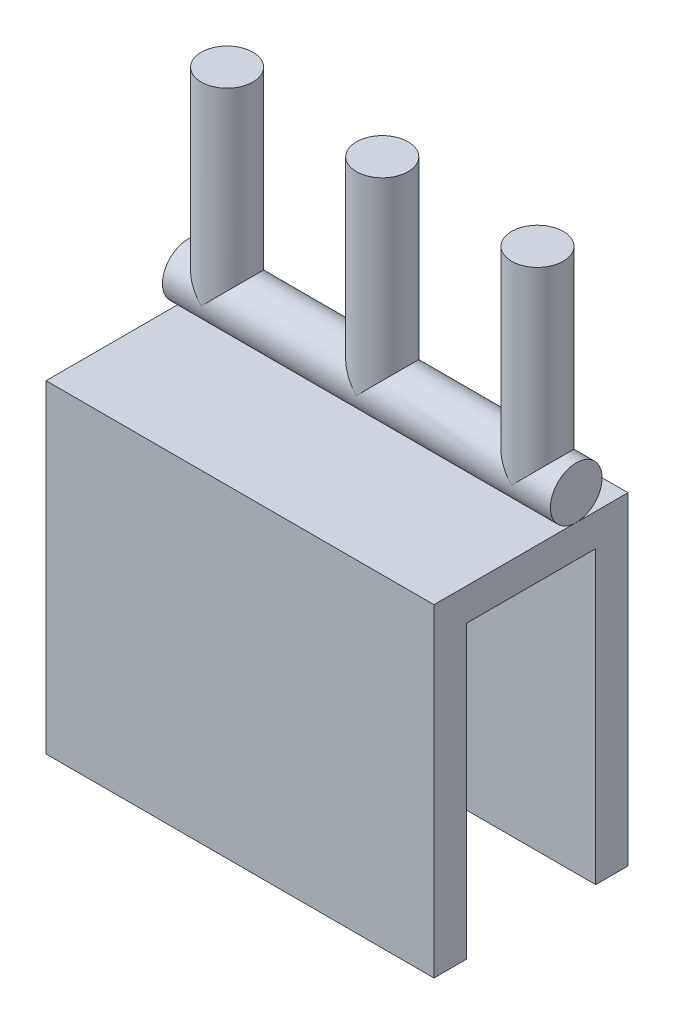
ISO-10303-21;
HEADER;
FILE_DESCRIPTION(('STEP AP214'),'2;1');
FILE_NAME('part.step','',(''),(''),'','','');
FILE_SCHEMA(('AUTOMOTIVE_DESIGN { 1 0 10303 214 1 1 1 1 }'));
ENDSEC;
DATA;
#1=APPLICATION_CONTEXT('core data for automotive mechanical design processes');
#2=APPLICATION_PROTOCOL_DEFINITION('international standard','automotive_design',2000,#1);
#3=PRODUCT_CONTEXT('',#1,'mechanical');
#4=PRODUCT('Part','Part','',(#3));
#5=PRODUCT_RELATED_PRODUCT_CATEGORY('part','',(#4));
#6=PRODUCT_DEFINITION_FORMATION('','',#4);
#7=PRODUCT_DEFINITION_CONTEXT('part definition',#1,'design');
#8=PRODUCT_DEFINITION('design','',#6,#7);
#9=PRODUCT_DEFINITION_SHAPE('','',#8);
#10=(LENGTH_UNIT() NAMED_UNIT(*) SI_UNIT(.MILLI.,.METRE.));
#11=(NAMED_UNIT(*) PLANE_ANGLE_UNIT() SI_UNIT($,.RADIAN.));
#12=(NAMED_UNIT(*) SI_UNIT($,.STERADIAN.) SOLID_ANGLE_UNIT());
#13=UNCERTAINTY_MEASURE_WITH_UNIT(LENGTH_MEASURE(1.E-05),#10,'distance_accuracy_value','');
#14=(GEOMETRIC_REPRESENTATION_CONTEXT(3) GLOBAL_UNCERTAINTY_ASSIGNED_CONTEXT((#13)) GLOBAL_UNIT_ASSIGNED_CONTEXT((#10,
#11,#12)) REPRESENTATION_CONTEXT('',''));
#15=CARTESIAN_POINT('',(0.,0.,0.));
#16=DIRECTION('',(0.,0.,1.));
#17=DIRECTION('',(1.,0.,0.));
#18=AXIS2_PLACEMENT_3D('',#15,#16,#17);
#19=CARTESIAN_POINT('',(300.,145.,-35.));
#20=DIRECTION('',(-1.,0.,0.));
#21=DIRECTION('',(0.,0.,1.));
#22=AXIS2_PLACEMENT_3D('',#19,#20,#21);
#23=CYLINDRICAL_SURFACE('',#22,20.);
#24=CARTESIAN_POINT('',(150.,145.,-35.));
#25=DIRECTION('',(-0.707106781186547,-0.707106781186547,0.));
#26=DIRECTION('',(-0.707106781186547,0.707106781186547,0.));
#27=AXIS2_PLACEMENT_3D('',#24,#25,#26);
#28=ELLIPSE('',#27,28.2842712474619,20.);
#29=CARTESIAN_POINT('',(150.,145.,-55.));
#30=VERTEX_POINT('',#29);
#31=CARTESIAN_POINT('',(150.,145.,-15.));
#32=VERTEX_POINT('',#31);
#33=EDGE_CURVE('E74',#30,#32,#28,.F.);
#34=ORIENTED_EDGE('',*,*,#33,.F.);
#35=CARTESIAN_POINT('',(150.,145.,-35.));
#36=DIRECTION('',(-0.707106781186547,0.707106781186547,0.));
#37=DIRECTION('',(-0.707106781186547,-0.707106781186547,0.));
#38=AXIS2_PLACEMENT_3D('',#35,#36,#37);
#39=ELLIPSE('',#38,28.2842712474619,20.);
#40=EDGE_CURVE('E61',#32,#30,#39,.T.);
#41=ORIENTED_EDGE('',*,*,#40,.F.);
#42=EDGE_LOOP('',(#34,#41));
#43=FACE_BOUND('',#42,.T.);
#44=CARTESIAN_POINT('',(0.,145.,-35.));
#45=DIRECTION('',(1.,0.,0.));
#46=DIRECTION('',(0.,0.,-1.));
#47=AXIS2_PLACEMENT_3D('',#44,#45,#46);
#48=CIRCLE('',#47,20.);
#49=CARTESIAN_POINT('',(0.,145.,-55.));
#50=VERTEX_POINT('',#49);
#51=EDGE_CURVE('E85',#50,#50,#48,.T.);
#52=ORIENTED_EDGE('',*,*,#51,.T.);
#53=EDGE_LOOP('',(#52));
#54=FACE_BOUND('',#53,.T.);
#55=CARTESIAN_POINT('',(300.,145.,-35.));
#56=DIRECTION('',(1.,0.,0.));
#57=DIRECTION('',(0.,0.,-1.));
#58=AXIS2_PLACEMENT_3D('',#55,#56,#57);
#59=CIRCLE('',#58,20.);
#60=CARTESIAN_POINT('',(300.,145.,-55.));
#61=VERTEX_POINT('',#60);
#62=EDGE_CURVE('E84',#61,#61,#59,.T.);
#63=ORIENTED_EDGE('',*,*,#62,.F.);
#64=EDGE_LOOP('',(#63));
#65=FACE_BOUND('',#64,.T.);
#66=CARTESIAN_POINT('',(30.,145.,-35.));
#67=DIRECTION('',(-0.707106781186547,-0.707106781186547,0.));
#68=DIRECTION('',(-0.707106781186547,0.707106781186547,0.));
#69=AXIS2_PLACEMENT_3D('',#66,#67,#68);
#70=ELLIPSE('',#69,28.2842712474619,20.);
#71=CARTESIAN_POINT('',(30.,145.,-55.));
#72=VERTEX_POINT('',#71);
#73=CARTESIAN_POINT('',(30.,145.,-15.));
#74=VERTEX_POINT('',#73);
#75=EDGE_CURVE('E78',#72,#74,#70,.F.);
#76=ORIENTED_EDGE('',*,*,#75,.F.);
#77=CARTESIAN_POINT('',(30.,145.,-35.));
#78=DIRECTION('',(-0.707106781186547,0.707106781186547,0.));
#79=DIRECTION('',(-0.707106781186547,-0.707106781186547,0.));
#80=AXIS2_PLACEMENT_3D('',#77,#78,#79);
#81=ELLIPSE('',#80,28.2842712474619,20.);
#82=EDGE_CURVE('E81',#74,#72,#81,.T.);
#83=ORIENTED_EDGE('',*,*,#82,.F.);
#84=EDGE_LOOP('',(#76,#83));
#85=FACE_BOUND('',#84,.T.);
#86=CARTESIAN_POINT('',(270.,145.,-35.));
#87=DIRECTION('',(-0.707106781186547,-0.707106781186547,0.));
#88=DIRECTION('',(-0.707106781186547,0.707106781186547,0.));
#89=AXIS2_PLACEMENT_3D('',#86,#87,#88);
#90=ELLIPSE('',#89,28.2842712474619,20.);
#91=CARTESIAN_POINT('',(270.,145.,-55.));
#92=VERTEX_POINT('',#91);
#93=CARTESIAN_POINT('',(270.,145.,-15.));
#94=VERTEX_POINT('',#93);
#95=EDGE_CURVE('E12',#92,#94,#90,.F.);
#96=ORIENTED_EDGE('',*,*,#95,.F.);
#97=CARTESIAN_POINT('',(270.,145.,-35.));
#98=DIRECTION('',(-0.707106781186547,0.707106781186547,0.));
#99=DIRECTION('',(-0.707106781186547,-0.707106781186547,0.));
#100=AXIS2_PLACEMENT_3D('',#97,#98,#99);
#101=ELLIPSE('',#100,28.2842712474619,20.);
#102=EDGE_CURVE('E50',#94,#92,#101,.T.);
#103=ORIENTED_EDGE('',*,*,#102,.F.);
#104=EDGE_LOOP('',(#96,#103));
#105=FACE_BOUND('',#104,.T.);
#106=ADVANCED_FACE('F43',(#43,#54,#65,#85,#105),#23,.T.);
#107=CARTESIAN_POINT('',(300.,145.,-35.));
#108=DIRECTION('',(1.,0.,0.));
#109=DIRECTION('',(0.,0.,-1.));
#110=AXIS2_PLACEMENT_3D('',#107,#108,#109);
#111=PLANE('',#110);
#112=ORIENTED_EDGE('',*,*,#62,.T.);
#113=EDGE_LOOP('',(#112));
#114=FACE_BOUND('',#113,.T.);
#115=ADVANCED_FACE('F114',(#114),#111,.T.);
#116=CARTESIAN_POINT('',(0.,145.,-35.));
#117=DIRECTION('',(1.,0.,0.));
#118=DIRECTION('',(0.,0.,-1.));
#119=AXIS2_PLACEMENT_3D('',#116,#117,#118);
#120=PLANE('',#119);
#121=ORIENTED_EDGE('',*,*,#51,.F.);
#122=EDGE_LOOP('',(#121));
#123=FACE_BOUND('',#122,.T.);
#124=ADVANCED_FACE('F118',(#123),#120,.F.);
#125=CARTESIAN_POINT('',(30.,295.,-35.));
#126=DIRECTION('',(0.,-1.,0.));
#127=DIRECTION('',(0.,0.,-1.));
#128=AXIS2_PLACEMENT_3D('',#125,#126,#127);
#129=CYLINDRICAL_SURFACE('',#128,20.);
#130=CARTESIAN_POINT('',(30.,295.,-35.));
#131=DIRECTION('',(0.,1.,0.));
#132=DIRECTION('',(0.,0.,1.));
#133=AXIS2_PLACEMENT_3D('',#130,#131,#132);
#134=CIRCLE('',#133,20.);
#135=CARTESIAN_POINT('',(30.,295.,-15.));
#136=VERTEX_POINT('',#135);
#137=EDGE_CURVE('E88',#136,#136,#134,.T.);
#138=ORIENTED_EDGE('',*,*,#137,.F.);
#139=EDGE_LOOP('',(#138));
#140=FACE_BOUND('',#139,.T.);
#141=ORIENTED_EDGE('',*,*,#82,.T.);
#142=ORIENTED_EDGE('',*,*,#75,.T.);
#143=EDGE_LOOP('',(#141,#142));
#144=FACE_BOUND('',#143,.T.);
#145=ADVANCED_FACE('F127',(#140,#144),#129,.T.);
#146=CARTESIAN_POINT('',(30.,295.,-35.));
#147=DIRECTION('',(0.,1.,0.));
#148=DIRECTION('',(0.,0.,1.));
#149=AXIS2_PLACEMENT_3D('',#146,#147,#148);
#150=PLANE('',#149);
#151=ORIENTED_EDGE('',*,*,#137,.T.);
#152=EDGE_LOOP('',(#151));
#153=FACE_BOUND('',#152,.T.);
#154=ADVANCED_FACE('F129',(#153),#150,.T.);
#155=CARTESIAN_POINT('',(150.,295.,-35.));
#156=DIRECTION('',(0.,-1.,0.));
#157=DIRECTION('',(0.,0.,-1.));
#158=AXIS2_PLACEMENT_3D('',#155,#156,#157);
#159=CYLINDRICAL_SURFACE('',#158,20.);
#160=CARTESIAN_POINT('',(150.,295.,-35.));
#161=DIRECTION('',(0.,1.,0.));
#162=DIRECTION('',(0.,0.,1.));
#163=AXIS2_PLACEMENT_3D('',#160,#161,#162);
#164=CIRCLE('',#163,20.);
#165=CARTESIAN_POINT('',(150.,295.,-15.));
#166=VERTEX_POINT('',#165);
#167=EDGE_CURVE('E93',#166,#166,#164,.T.);
#168=ORIENTED_EDGE('',*,*,#167,.F.);
#169=EDGE_LOOP('',(#168));
#170=FACE_BOUND('',#169,.T.);
#171=ORIENTED_EDGE('',*,*,#40,.T.);
#172=ORIENTED_EDGE('',*,*,#33,.T.);
#173=EDGE_LOOP('',(#171,#172));
#174=FACE_BOUND('',#173,.T.);
#175=ADVANCED_FACE('F110',(#170,#174),#159,.T.);
#176=CARTESIAN_POINT('',(150.,295.,-35.));
#177=DIRECTION('',(0.,1.,0.));
#178=DIRECTION('',(0.,0.,1.));
#179=AXIS2_PLACEMENT_3D('',#176,#177,#178);
#180=PLANE('',#179);
#181=ORIENTED_EDGE('',*,*,#167,.T.);
#182=EDGE_LOOP('',(#181));
#183=FACE_BOUND('',#182,.T.);
#184=ADVANCED_FACE('F103',(#183),#180,.T.);
#185=CARTESIAN_POINT('',(270.,295.,-35.));
#186=DIRECTION('',(0.,-1.,0.));
#187=DIRECTION('',(0.,0.,-1.));
#188=AXIS2_PLACEMENT_3D('',#185,#186,#187);
#189=CYLINDRICAL_SURFACE('',#188,20.);
#190=CARTESIAN_POINT('',(270.,295.,-35.));
#191=DIRECTION('',(0.,1.,0.));
#192=DIRECTION('',(0.,0.,1.));
#193=AXIS2_PLACEMENT_3D('',#190,#191,#192);
#194=CIRCLE('',#193,20.);
#195=CARTESIAN_POINT('',(270.,295.,-15.));
#196=VERTEX_POINT('',#195);
#197=EDGE_CURVE('E96',#196,#196,#194,.T.);
#198=ORIENTED_EDGE('',*,*,#197,.F.);
#199=EDGE_LOOP('',(#198));
#200=FACE_BOUND('',#199,.T.);
#201=ORIENTED_EDGE('',*,*,#102,.T.);
#202=ORIENTED_EDGE('',*,*,#95,.T.);
#203=EDGE_LOOP('',(#201,#202));
#204=FACE_BOUND('',#203,.T.);
#205=ADVANCED_FACE('F73',(#200,#204),#189,.T.);
#206=CARTESIAN_POINT('',(270.,295.,-35.));
#207=DIRECTION('',(0.,1.,0.));
#208=DIRECTION('',(0.,0.,1.));
#209=AXIS2_PLACEMENT_3D('',#206,#207,#208);
#210=PLANE('',#209);
#211=ORIENTED_EDGE('',*,*,#197,.T.);
#212=EDGE_LOOP('',(#211));
#213=FACE_BOUND('',#212,.T.);
#214=ADVANCED_FACE('F100',(#213),#210,.T.);
#215=CLOSED_SHELL('',(#106,#115,#124,#145,#154,#175,#184,#205,#214));
#216=MANIFOLD_SOLID_BREP('B2',#215);
#217=CARTESIAN_POINT('',(300.,-125.,75.));
#218=DIRECTION('',(0.,0.,-1.));
#219=DIRECTION('',(-1.,0.,0.));
#220=AXIS2_PLACEMENT_3D('',#217,#218,#219);
#221=PLANE('',#220);
#222=DIRECTION('',(0.,-1.,0.));
#223=VECTOR('',#222,1.);
#224=CARTESIAN_POINT('',(0.,-125.,75.));
#225=LINE('',#224,#223);
#226=CARTESIAN_POINT('',(0.,125.,75.));
#227=VERTEX_POINT('',#226);
#228=CARTESIAN_POINT('',(0.,-125.,75.));
#229=VERTEX_POINT('',#228);
#230=EDGE_CURVE('E292',#227,#229,#225,.T.);
#231=ORIENTED_EDGE('',*,*,#230,.T.);
#232=DIRECTION('',(-1.,0.,0.));
#233=VECTOR('',#232,1.);
#234=CARTESIAN_POINT('',(300.,-125.,75.));
#235=LINE('',#234,#233);
#236=CARTESIAN_POINT('',(300.,-125.,75.));
#237=VERTEX_POINT('',#236);
#238=EDGE_CURVE('E41',#237,#229,#235,.T.);
#239=ORIENTED_EDGE('',*,*,#238,.F.);
#240=DIRECTION('',(0.,-1.,0.));
#241=VECTOR('',#240,1.);
#242=CARTESIAN_POINT('',(300.,-125.,75.));
#243=LINE('',#242,#241);
#244=CARTESIAN_POINT('',(300.,125.,75.));
#245=VERTEX_POINT('',#244);
#246=EDGE_CURVE('E306',#245,#237,#243,.T.);
#247=ORIENTED_EDGE('',*,*,#246,.F.);
#248=DIRECTION('',(-1.,0.,0.));
#249=VECTOR('',#248,1.);
#250=CARTESIAN_POINT('',(300.,125.,75.));
#251=LINE('',#250,#249);
#252=EDGE_CURVE('E288',#245,#227,#251,.T.);
#253=ORIENTED_EDGE('',*,*,#252,.T.);
#254=EDGE_LOOP('',(#231,#239,#247,#253));
#255=FACE_BOUND('',#254,.T.);
#256=ADVANCED_FACE('F196',(#255),#221,.F.);
#257=CARTESIAN_POINT('',(300.,-125.,50.));
#258=DIRECTION('',(0.,1.,0.));
#259=DIRECTION('',(0.,0.,1.));
#260=AXIS2_PLACEMENT_3D('',#257,#258,#259);
#261=PLANE('',#260);
#262=DIRECTION('',(0.,0.,-1.));
#263=VECTOR('',#262,1.);
#264=CARTESIAN_POINT('',(0.,-125.,50.));
#265=LINE('',#264,#263);
#266=CARTESIAN_POINT('',(0.,-125.,50.));
#267=VERTEX_POINT('',#266);
#268=EDGE_CURVE('E295',#229,#267,#265,.T.);
#269=ORIENTED_EDGE('',*,*,#268,.T.);
#270=DIRECTION('',(-1.,0.,0.));
#271=VECTOR('',#270,1.);
#272=CARTESIAN_POINT('',(300.,-125.,50.));
#273=LINE('',#272,#271);
#274=CARTESIAN_POINT('',(300.,-125.,50.));
#275=VERTEX_POINT('',#274);
#276=EDGE_CURVE('E204',#275,#267,#273,.T.);
#277=ORIENTED_EDGE('',*,*,#276,.F.);
#278=DIRECTION('',(0.,0.,-1.));
#279=VECTOR('',#278,1.);
#280=CARTESIAN_POINT('',(300.,-125.,50.));
#281=LINE('',#280,#279);
#282=EDGE_CURVE('E255',#237,#275,#281,.T.);
#283=ORIENTED_EDGE('',*,*,#282,.F.);
#284=ORIENTED_EDGE('',*,*,#238,.T.);
#285=EDGE_LOOP('',(#269,#277,#283,#284));
#286=FACE_BOUND('',#285,.T.);
#287=ADVANCED_FACE('F341',(#286),#261,.F.);
#288=CARTESIAN_POINT('',(300.,-125.,50.));
#289=DIRECTION('',(0.,0.,1.));
#290=DIRECTION('',(1.,0.,0.));
#291=AXIS2_PLACEMENT_3D('',#288,#289,#290);
#292=PLANE('',#291);
#293=DIRECTION('',(0.,1.,0.));
#294=VECTOR('',#293,1.);
#295=CARTESIAN_POINT('',(0.,-125.,50.));
#296=LINE('',#295,#294);
#297=CARTESIAN_POINT('',(0.,100.,50.));
#298=VERTEX_POINT('',#297);
#299=EDGE_CURVE('E297',#267,#298,#296,.T.);
#300=ORIENTED_EDGE('',*,*,#299,.T.);
#301=DIRECTION('',(-1.,0.,0.));
#302=VECTOR('',#301,1.);
#303=CARTESIAN_POINT('',(300.,100.,50.));
#304=LINE('',#303,#302);
#305=CARTESIAN_POINT('',(300.,100.,50.));
#306=VERTEX_POINT('',#305);
#307=EDGE_CURVE('E313',#306,#298,#304,.T.);
#308=ORIENTED_EDGE('',*,*,#307,.F.);
#309=DIRECTION('',(0.,1.,0.));
#310=VECTOR('',#309,1.);
#311=CARTESIAN_POINT('',(300.,-125.,50.));
#312=LINE('',#311,#310);
#313=EDGE_CURVE('E321',#275,#306,#312,.T.);
#314=ORIENTED_EDGE('',*,*,#313,.F.);
#315=ORIENTED_EDGE('',*,*,#276,.T.);
#316=EDGE_LOOP('',(#300,#308,#314,#315));
#317=FACE_BOUND('',#316,.T.);
#318=ADVANCED_FACE('F319',(#317),#292,.F.);
#319=CARTESIAN_POINT('',(300.,100.,50.));
#320=DIRECTION('',(0.,1.,0.));
#321=DIRECTION('',(0.,0.,1.));
#322=AXIS2_PLACEMENT_3D('',#319,#320,#321);
#323=PLANE('',#322);
#324=DIRECTION('',(0.,0.,-1.));
#325=VECTOR('',#324,1.);
#326=CARTESIAN_POINT('',(0.,100.,50.));
#327=LINE('',#326,#325);
#328=CARTESIAN_POINT('',(0.,100.,-50.));
#329=VERTEX_POINT('',#328);
#330=EDGE_CURVE('E299',#298,#329,#327,.T.);
#331=ORIENTED_EDGE('',*,*,#330,.T.);
#332=DIRECTION('',(-1.,0.,0.));
#333=VECTOR('',#332,1.);
#334=CARTESIAN_POINT('',(300.,100.,-50.));
#335=LINE('',#334,#333);
#336=CARTESIAN_POINT('',(300.,100.,-50.));
#337=VERTEX_POINT('',#336);
#338=EDGE_CURVE('E310',#337,#329,#335,.T.);
#339=ORIENTED_EDGE('',*,*,#338,.F.);
#340=DIRECTION('',(0.,0.,-1.));
#341=VECTOR('',#340,1.);
#342=CARTESIAN_POINT('',(300.,100.,50.));
#343=LINE('',#342,#341);
#344=EDGE_CURVE('E333',#306,#337,#343,.T.);
#345=ORIENTED_EDGE('',*,*,#344,.F.);
#346=ORIENTED_EDGE('',*,*,#307,.T.);
#347=EDGE_LOOP('',(#331,#339,#345,#346));
#348=FACE_BOUND('',#347,.T.);
#349=ADVANCED_FACE('F329',(#348),#323,.F.);
#350=CARTESIAN_POINT('',(300.,-125.,-50.));
#351=DIRECTION('',(0.,0.,-1.));
#352=DIRECTION('',(-1.,0.,0.));
#353=AXIS2_PLACEMENT_3D('',#350,#351,#352);
#354=PLANE('',#353);
#355=DIRECTION('',(0.,-1.,0.));
#356=VECTOR('',#355,1.);
#357=CARTESIAN_POINT('',(0.,-125.,-50.));
#358=LINE('',#357,#356);
#359=CARTESIAN_POINT('',(0.,-125.,-50.));
#360=VERTEX_POINT('',#359);
#361=EDGE_CURVE('E301',#329,#360,#358,.T.);
#362=ORIENTED_EDGE('',*,*,#361,.T.);
#363=DIRECTION('',(-1.,0.,0.));
#364=VECTOR('',#363,1.);
#365=CARTESIAN_POINT('',(300.,-125.,-50.));
#366=LINE('',#365,#364);
#367=CARTESIAN_POINT('',(300.,-125.,-50.));
#368=VERTEX_POINT('',#367);
#369=EDGE_CURVE('E283',#368,#360,#366,.T.);
#370=ORIENTED_EDGE('',*,*,#369,.F.);
#371=DIRECTION('',(0.,-1.,0.));
#372=VECTOR('',#371,1.);
#373=CARTESIAN_POINT('',(300.,-125.,-50.));
#374=LINE('',#373,#372);
#375=EDGE_CURVE('E274',#337,#368,#374,.T.);
#376=ORIENTED_EDGE('',*,*,#375,.F.);
#377=ORIENTED_EDGE('',*,*,#338,.T.);
#378=EDGE_LOOP('',(#362,#370,#376,#377));
#379=FACE_BOUND('',#378,.T.);
#380=ADVANCED_FACE('F332',(#379),#354,.F.);
#381=CARTESIAN_POINT('',(300.,-125.,-75.));
#382=DIRECTION('',(0.,1.,0.));
#383=DIRECTION('',(0.,0.,1.));
#384=AXIS2_PLACEMENT_3D('',#381,#382,#383);
#385=PLANE('',#384);
#386=DIRECTION('',(0.,0.,-1.));
#387=VECTOR('',#386,1.);
#388=CARTESIAN_POINT('',(0.,-125.,-75.));
#389=LINE('',#388,#387);
#390=CARTESIAN_POINT('',(0.,-125.,-75.));
#391=VERTEX_POINT('',#390);
#392=EDGE_CURVE('E282',#360,#391,#389,.T.);
#393=ORIENTED_EDGE('',*,*,#392,.T.);
#394=DIRECTION('',(-1.,0.,0.));
#395=VECTOR('',#394,1.);
#396=CARTESIAN_POINT('',(300.,-125.,-75.));
#397=LINE('',#396,#395);
#398=CARTESIAN_POINT('',(300.,-125.,-75.));
#399=VERTEX_POINT('',#398);
#400=EDGE_CURVE('E279',#399,#391,#397,.T.);
#401=ORIENTED_EDGE('',*,*,#400,.F.);
#402=DIRECTION('',(0.,0.,-1.));
#403=VECTOR('',#402,1.);
#404=CARTESIAN_POINT('',(300.,-125.,-75.));
#405=LINE('',#404,#403);
#406=EDGE_CURVE('E268',#368,#399,#405,.T.);
#407=ORIENTED_EDGE('',*,*,#406,.F.);
#408=ORIENTED_EDGE('',*,*,#369,.T.);
#409=EDGE_LOOP('',(#393,#401,#407,#408));
#410=FACE_BOUND('',#409,.T.);
#411=ADVANCED_FACE('F280',(#410),#385,.F.);
#412=CARTESIAN_POINT('',(300.,-125.,-75.));
#413=DIRECTION('',(0.,0.,1.));
#414=DIRECTION('',(1.,0.,0.));
#415=AXIS2_PLACEMENT_3D('',#412,#413,#414);
#416=PLANE('',#415);
#417=DIRECTION('',(0.,1.,0.));
#418=VECTOR('',#417,1.);
#419=CARTESIAN_POINT('',(0.,-125.,-75.));
#420=LINE('',#419,#418);
#421=CARTESIAN_POINT('',(0.,125.,-75.));
#422=VERTEX_POINT('',#421);
#423=EDGE_CURVE('E241',#391,#422,#420,.T.);
#424=ORIENTED_EDGE('',*,*,#423,.T.);
#425=DIRECTION('',(-1.,0.,0.));
#426=VECTOR('',#425,1.);
#427=CARTESIAN_POINT('',(300.,125.,-75.));
#428=LINE('',#427,#426);
#429=CARTESIAN_POINT('',(300.,125.,-75.));
#430=VERTEX_POINT('',#429);
#431=EDGE_CURVE('E284',#430,#422,#428,.T.);
#432=ORIENTED_EDGE('',*,*,#431,.F.);
#433=DIRECTION('',(0.,1.,0.));
#434=VECTOR('',#433,1.);
#435=CARTESIAN_POINT('',(300.,-125.,-75.));
#436=LINE('',#435,#434);
#437=EDGE_CURVE('E272',#399,#430,#436,.T.);
#438=ORIENTED_EDGE('',*,*,#437,.F.);
#439=ORIENTED_EDGE('',*,*,#400,.T.);
#440=EDGE_LOOP('',(#424,#432,#438,#439));
#441=FACE_BOUND('',#440,.T.);
#442=ADVANCED_FACE('F286',(#441),#416,.F.);
#443=CARTESIAN_POINT('',(300.,125.,-75.));
#444=DIRECTION('',(0.,-1.,0.));
#445=DIRECTION('',(0.,0.,-1.));
#446=AXIS2_PLACEMENT_3D('',#443,#444,#445);
#447=PLANE('',#446);
#448=DIRECTION('',(0.,0.,1.));
#449=VECTOR('',#448,1.);
#450=CARTESIAN_POINT('',(0.,125.,-75.));
#451=LINE('',#450,#449);
#452=EDGE_CURVE('E247',#422,#227,#451,.T.);
#453=ORIENTED_EDGE('',*,*,#452,.T.);
#454=ORIENTED_EDGE('',*,*,#252,.F.);
#455=DIRECTION('',(0.,0.,1.));
#456=VECTOR('',#455,1.);
#457=CARTESIAN_POINT('',(300.,125.,-75.));
#458=LINE('',#457,#456);
#459=EDGE_CURVE('E212',#430,#245,#458,.T.);
#460=ORIENTED_EDGE('',*,*,#459,.F.);
#461=ORIENTED_EDGE('',*,*,#431,.T.);
#462=EDGE_LOOP('',(#453,#454,#460,#461));
#463=FACE_BOUND('',#462,.T.);
#464=ADVANCED_FACE('F357',(#463),#447,.F.);
#465=CARTESIAN_POINT('',(300.,0.,0.));
#466=DIRECTION('',(1.,0.,0.));
#467=DIRECTION('',(0.,0.,-1.));
#468=AXIS2_PLACEMENT_3D('',#465,#466,#467);
#469=PLANE('',#468);
#470=ORIENTED_EDGE('',*,*,#246,.T.);
#471=ORIENTED_EDGE('',*,*,#282,.T.);
#472=ORIENTED_EDGE('',*,*,#313,.T.);
#473=ORIENTED_EDGE('',*,*,#344,.T.);
#474=ORIENTED_EDGE('',*,*,#375,.T.);
#475=ORIENTED_EDGE('',*,*,#406,.T.);
#476=ORIENTED_EDGE('',*,*,#437,.T.);
#477=ORIENTED_EDGE('',*,*,#459,.T.);
#478=EDGE_LOOP('',(#470,#471,#472,#473,#474,#475,#476,#477));
#479=FACE_BOUND('',#478,.T.);
#480=ADVANCED_FACE('F270',(#479),#469,.T.);
#481=CARTESIAN_POINT('',(0.,0.,0.));
#482=DIRECTION('',(1.,0.,0.));
#483=DIRECTION('',(0.,0.,-1.));
#484=AXIS2_PLACEMENT_3D('',#481,#482,#483);
#485=PLANE('',#484);
#486=ORIENTED_EDGE('',*,*,#230,.F.);
#487=ORIENTED_EDGE('',*,*,#452,.F.);
#488=ORIENTED_EDGE('',*,*,#423,.F.);
#489=ORIENTED_EDGE('',*,*,#392,.F.);
#490=ORIENTED_EDGE('',*,*,#361,.F.);
#491=ORIENTED_EDGE('',*,*,#330,.F.);
#492=ORIENTED_EDGE('',*,*,#299,.F.);
#493=ORIENTED_EDGE('',*,*,#268,.F.);
#494=EDGE_LOOP('',(#486,#487,#488,#489,#490,#491,#492,#493));
#495=FACE_BOUND('',#494,.T.);
#496=ADVANCED_FACE('F325',(#495),#485,.F.);
#497=CLOSED_SHELL('',(#256,#287,#318,#349,#380,#411,#442,#464,#480,#496));
#498=MANIFOLD_SOLID_BREP('B6',#497);
#499=ADVANCED_BREP_SHAPE_REPRESENTATION('',(#18,#216,#498),#14);
#500=SHAPE_DEFINITION_REPRESENTATION(#9,#499);
ENDSEC;
END-ISO-10303-21;
